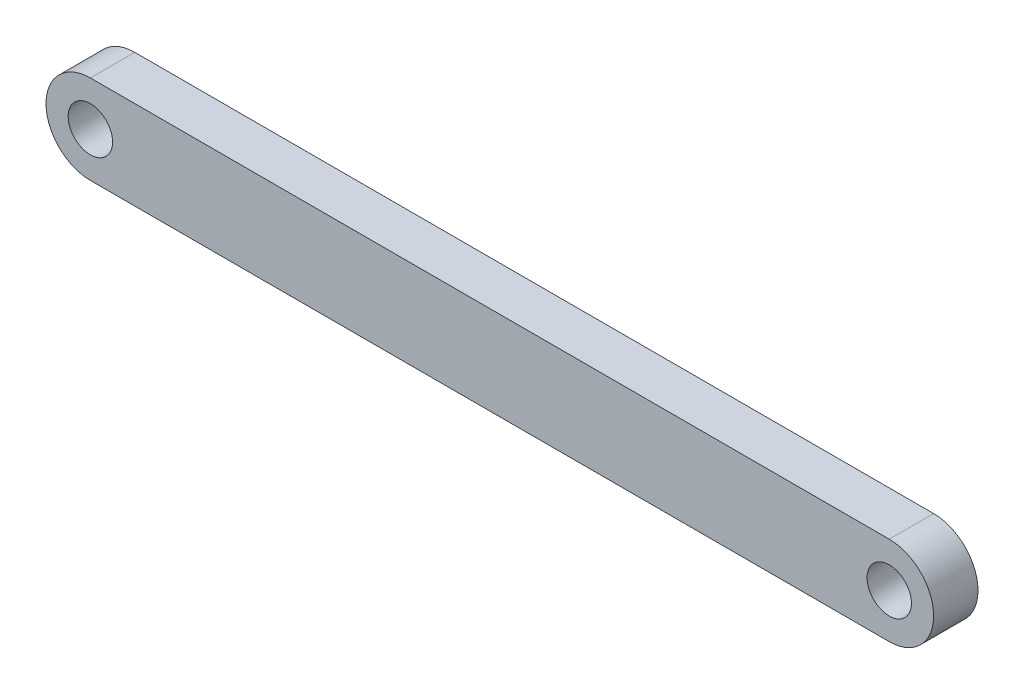
ISO-10303-21;
HEADER;
FILE_DESCRIPTION(('STEP AP214'),'2;1');
FILE_NAME('part.step','',(''),(''),'','','');
FILE_SCHEMA(('AUTOMOTIVE_DESIGN { 1 0 10303 214 1 1 1 1 }'));
ENDSEC;
DATA;
#1=APPLICATION_CONTEXT('core data for automotive mechanical design processes');
#2=APPLICATION_PROTOCOL_DEFINITION('international standard','automotive_design',2000,#1);
#3=PRODUCT_CONTEXT('',#1,'mechanical');
#4=PRODUCT('Part','Part','',(#3));
#5=PRODUCT_RELATED_PRODUCT_CATEGORY('part','',(#4));
#6=PRODUCT_DEFINITION_FORMATION('','',#4);
#7=PRODUCT_DEFINITION_CONTEXT('part definition',#1,'design');
#8=PRODUCT_DEFINITION('design','',#6,#7);
#9=PRODUCT_DEFINITION_SHAPE('','',#8);
#10=(LENGTH_UNIT() NAMED_UNIT(*) SI_UNIT(.MILLI.,.METRE.));
#11=(NAMED_UNIT(*) PLANE_ANGLE_UNIT() SI_UNIT($,.RADIAN.));
#12=(NAMED_UNIT(*) SI_UNIT($,.STERADIAN.) SOLID_ANGLE_UNIT());
#13=UNCERTAINTY_MEASURE_WITH_UNIT(LENGTH_MEASURE(1.E-05),#10,'distance_accuracy_value','');
#14=(GEOMETRIC_REPRESENTATION_CONTEXT(3) GLOBAL_UNCERTAINTY_ASSIGNED_CONTEXT((#13)) GLOBAL_UNIT_ASSIGNED_CONTEXT((#10,
#11,#12)) REPRESENTATION_CONTEXT('',''));
#15=CARTESIAN_POINT('',(0.,0.,0.));
#16=DIRECTION('',(0.,0.,1.));
#17=DIRECTION('',(1.,0.,0.));
#18=AXIS2_PLACEMENT_3D('',#15,#16,#17);
#19=CARTESIAN_POINT('',(0.,0.,2.));
#20=DIRECTION('',(0.,0.,1.));
#21=DIRECTION('',(1.,0.,0.));
#22=AXIS2_PLACEMENT_3D('',#19,#20,#21);
#23=PLANE('',#22);
#24=CARTESIAN_POINT('',(0.,0.,2.));
#25=DIRECTION('',(0.,0.,1.));
#26=DIRECTION('',(1.,0.,0.));
#27=AXIS2_PLACEMENT_3D('',#24,#25,#26);
#28=CIRCLE('',#27,1.);
#29=CARTESIAN_POINT('',(1.,0.,2.));
#30=VERTEX_POINT('',#29);
#31=EDGE_CURVE('E116',#30,#30,#28,.T.);
#32=ORIENTED_EDGE('',*,*,#31,.F.);
#33=EDGE_LOOP('',(#32));
#34=FACE_BOUND('',#33,.T.);
#35=CARTESIAN_POINT('',(0.,0.,2.));
#36=DIRECTION('',(0.,0.,1.));
#37=DIRECTION('',(1.,0.,0.));
#38=AXIS2_PLACEMENT_3D('',#35,#36,#37);
#39=CIRCLE('',#38,2.);
#40=CARTESIAN_POINT('',(0.,2.,2.));
#41=VERTEX_POINT('',#40);
#42=CARTESIAN_POINT('',(0.,-2.,2.));
#43=VERTEX_POINT('',#42);
#44=EDGE_CURVE('E96',#41,#43,#39,.T.);
#45=ORIENTED_EDGE('',*,*,#44,.T.);
#46=DIRECTION('',(1.,0.,0.));
#47=VECTOR('',#46,1.);
#48=CARTESIAN_POINT('',(0.,-2.,2.));
#49=LINE('',#48,#47);
#50=CARTESIAN_POINT('',(36.,-2.,2.));
#51=VERTEX_POINT('',#50);
#52=EDGE_CURVE('E91',#43,#51,#49,.T.);
#53=ORIENTED_EDGE('',*,*,#52,.T.);
#54=CARTESIAN_POINT('',(36.,0.,2.));
#55=DIRECTION('',(0.,0.,1.));
#56=DIRECTION('',(1.,0.,0.));
#57=AXIS2_PLACEMENT_3D('',#54,#55,#56);
#58=CIRCLE('',#57,2.);
#59=CARTESIAN_POINT('',(36.,2.,2.));
#60=VERTEX_POINT('',#59);
#61=EDGE_CURVE('E94',#51,#60,#58,.T.);
#62=ORIENTED_EDGE('',*,*,#61,.T.);
#63=DIRECTION('',(-1.,0.,0.));
#64=VECTOR('',#63,1.);
#65=CARTESIAN_POINT('',(0.,2.,2.));
#66=LINE('',#65,#64);
#67=EDGE_CURVE('E61',#60,#41,#66,.T.);
#68=ORIENTED_EDGE('',*,*,#67,.T.);
#69=EDGE_LOOP('',(#45,#53,#62,#68));
#70=FACE_BOUND('',#69,.T.);
#71=CARTESIAN_POINT('',(36.,0.,2.));
#72=DIRECTION('',(0.,0.,1.));
#73=DIRECTION('',(1.,0.,0.));
#74=AXIS2_PLACEMENT_3D('',#71,#72,#73);
#75=CIRCLE('',#74,0.999999999999998);
#76=CARTESIAN_POINT('',(37.,0.,2.));
#77=VERTEX_POINT('',#76);
#78=EDGE_CURVE('E138',#77,#77,#75,.T.);
#79=ORIENTED_EDGE('',*,*,#78,.F.);
#80=EDGE_LOOP('',(#79));
#81=FACE_BOUND('',#80,.T.);
#82=ADVANCED_FACE('F43',(#34,#70,#81),#23,.T.);
#83=CARTESIAN_POINT('',(0.,0.,0.));
#84=DIRECTION('',(0.,0.,1.));
#85=DIRECTION('',(1.,0.,0.));
#86=AXIS2_PLACEMENT_3D('',#83,#84,#85);
#87=PLANE('',#86);
#88=CARTESIAN_POINT('',(0.,0.,0.));
#89=DIRECTION('',(0.,0.,1.));
#90=DIRECTION('',(1.,0.,0.));
#91=AXIS2_PLACEMENT_3D('',#88,#89,#90);
#92=CIRCLE('',#91,2.);
#93=CARTESIAN_POINT('',(0.,2.,0.));
#94=VERTEX_POINT('',#93);
#95=CARTESIAN_POINT('',(0.,-2.,0.));
#96=VERTEX_POINT('',#95);
#97=EDGE_CURVE('E112',#94,#96,#92,.T.);
#98=ORIENTED_EDGE('',*,*,#97,.F.);
#99=DIRECTION('',(-1.,0.,0.));
#100=VECTOR('',#99,1.);
#101=CARTESIAN_POINT('',(0.,2.,0.));
#102=LINE('',#101,#100);
#103=CARTESIAN_POINT('',(36.,2.,0.));
#104=VERTEX_POINT('',#103);
#105=EDGE_CURVE('E84',#104,#94,#102,.T.);
#106=ORIENTED_EDGE('',*,*,#105,.F.);
#107=CARTESIAN_POINT('',(36.,0.,0.));
#108=DIRECTION('',(0.,0.,1.));
#109=DIRECTION('',(1.,0.,0.));
#110=AXIS2_PLACEMENT_3D('',#107,#108,#109);
#111=CIRCLE('',#110,2.);
#112=CARTESIAN_POINT('',(36.,-2.,0.));
#113=VERTEX_POINT('',#112);
#114=EDGE_CURVE('E78',#113,#104,#111,.T.);
#115=ORIENTED_EDGE('',*,*,#114,.F.);
#116=DIRECTION('',(1.,0.,0.));
#117=VECTOR('',#116,1.);
#118=CARTESIAN_POINT('',(0.,-2.,0.));
#119=LINE('',#118,#117);
#120=EDGE_CURVE('E101',#96,#113,#119,.T.);
#121=ORIENTED_EDGE('',*,*,#120,.F.);
#122=EDGE_LOOP('',(#98,#106,#115,#121));
#123=FACE_BOUND('',#122,.T.);
#124=CARTESIAN_POINT('',(0.,0.,0.));
#125=DIRECTION('',(0.,0.,1.));
#126=DIRECTION('',(1.,0.,0.));
#127=AXIS2_PLACEMENT_3D('',#124,#125,#126);
#128=CIRCLE('',#127,1.);
#129=CARTESIAN_POINT('',(1.,0.,0.));
#130=VERTEX_POINT('',#129);
#131=EDGE_CURVE('E134',#130,#130,#128,.T.);
#132=ORIENTED_EDGE('',*,*,#131,.T.);
#133=EDGE_LOOP('',(#132));
#134=FACE_BOUND('',#133,.T.);
#135=CARTESIAN_POINT('',(36.,0.,0.));
#136=DIRECTION('',(0.,0.,1.));
#137=DIRECTION('',(1.,0.,0.));
#138=AXIS2_PLACEMENT_3D('',#135,#136,#137);
#139=CIRCLE('',#138,0.999999999999998);
#140=CARTESIAN_POINT('',(37.,0.,0.));
#141=VERTEX_POINT('',#140);
#142=EDGE_CURVE('E142',#141,#141,#139,.T.);
#143=ORIENTED_EDGE('',*,*,#142,.T.);
#144=EDGE_LOOP('',(#143));
#145=FACE_BOUND('',#144,.T.);
#146=ADVANCED_FACE('F129',(#123,#134,#145),#87,.F.);
#147=CARTESIAN_POINT('',(0.,0.,2.));
#148=DIRECTION('',(0.,0.,-1.));
#149=DIRECTION('',(-1.,0.,0.));
#150=AXIS2_PLACEMENT_3D('',#147,#148,#149);
#151=CYLINDRICAL_SURFACE('',#150,2.);
#152=ORIENTED_EDGE('',*,*,#97,.T.);
#153=DIRECTION('',(0.,0.,-1.));
#154=VECTOR('',#153,1.);
#155=CARTESIAN_POINT('',(0.,-2.,2.));
#156=LINE('',#155,#154);
#157=EDGE_CURVE('E11',#43,#96,#156,.T.);
#158=ORIENTED_EDGE('',*,*,#157,.F.);
#159=ORIENTED_EDGE('',*,*,#44,.F.);
#160=DIRECTION('',(0.,0.,-1.));
#161=VECTOR('',#160,1.);
#162=CARTESIAN_POINT('',(0.,2.,2.));
#163=LINE('',#162,#161);
#164=EDGE_CURVE('E108',#41,#94,#163,.T.);
#165=ORIENTED_EDGE('',*,*,#164,.T.);
#166=EDGE_LOOP('',(#152,#158,#159,#165));
#167=FACE_BOUND('',#166,.T.);
#168=ADVANCED_FACE('F45',(#167),#151,.T.);
#169=CARTESIAN_POINT('',(0.,-2.,2.));
#170=DIRECTION('',(0.,1.,0.));
#171=DIRECTION('',(0.,0.,1.));
#172=AXIS2_PLACEMENT_3D('',#169,#170,#171);
#173=PLANE('',#172);
#174=ORIENTED_EDGE('',*,*,#120,.T.);
#175=DIRECTION('',(0.,0.,-1.));
#176=VECTOR('',#175,1.);
#177=CARTESIAN_POINT('',(36.,-2.,2.));
#178=LINE('',#177,#176);
#179=EDGE_CURVE('E53',#51,#113,#178,.T.);
#180=ORIENTED_EDGE('',*,*,#179,.F.);
#181=ORIENTED_EDGE('',*,*,#52,.F.);
#182=ORIENTED_EDGE('',*,*,#157,.T.);
#183=EDGE_LOOP('',(#174,#180,#181,#182));
#184=FACE_BOUND('',#183,.T.);
#185=ADVANCED_FACE('F100',(#184),#173,.F.);
#186=CARTESIAN_POINT('',(36.,0.,2.));
#187=DIRECTION('',(0.,0.,-1.));
#188=DIRECTION('',(-1.,0.,0.));
#189=AXIS2_PLACEMENT_3D('',#186,#187,#188);
#190=CYLINDRICAL_SURFACE('',#189,2.);
#191=ORIENTED_EDGE('',*,*,#114,.T.);
#192=DIRECTION('',(0.,0.,-1.));
#193=VECTOR('',#192,1.);
#194=CARTESIAN_POINT('',(36.,2.,2.));
#195=LINE('',#194,#193);
#196=EDGE_CURVE('E103',#60,#104,#195,.T.);
#197=ORIENTED_EDGE('',*,*,#196,.F.);
#198=ORIENTED_EDGE('',*,*,#61,.F.);
#199=ORIENTED_EDGE('',*,*,#179,.T.);
#200=EDGE_LOOP('',(#191,#197,#198,#199));
#201=FACE_BOUND('',#200,.T.);
#202=ADVANCED_FACE('F104',(#201),#190,.T.);
#203=CARTESIAN_POINT('',(0.,2.,2.));
#204=DIRECTION('',(0.,-1.,0.));
#205=DIRECTION('',(0.,0.,-1.));
#206=AXIS2_PLACEMENT_3D('',#203,#204,#205);
#207=PLANE('',#206);
#208=ORIENTED_EDGE('',*,*,#105,.T.);
#209=ORIENTED_EDGE('',*,*,#164,.F.);
#210=ORIENTED_EDGE('',*,*,#67,.F.);
#211=ORIENTED_EDGE('',*,*,#196,.T.);
#212=EDGE_LOOP('',(#208,#209,#210,#211));
#213=FACE_BOUND('',#212,.T.);
#214=ADVANCED_FACE('F126',(#213),#207,.F.);
#215=CARTESIAN_POINT('',(0.,0.,2.));
#216=DIRECTION('',(0.,0.,-1.));
#217=DIRECTION('',(-1.,0.,0.));
#218=AXIS2_PLACEMENT_3D('',#215,#216,#217);
#219=CYLINDRICAL_SURFACE('',#218,1.);
#220=ORIENTED_EDGE('',*,*,#31,.T.);
#221=EDGE_LOOP('',(#220));
#222=FACE_BOUND('',#221,.T.);
#223=ORIENTED_EDGE('',*,*,#131,.F.);
#224=EDGE_LOOP('',(#223));
#225=FACE_BOUND('',#224,.T.);
#226=ADVANCED_FACE('F161',(#222,#225),#219,.F.);
#227=CARTESIAN_POINT('',(36.,0.,2.));
#228=DIRECTION('',(0.,0.,-1.));
#229=DIRECTION('',(-1.,0.,0.));
#230=AXIS2_PLACEMENT_3D('',#227,#228,#229);
#231=CYLINDRICAL_SURFACE('',#230,0.999999999999998);
#232=ORIENTED_EDGE('',*,*,#78,.T.);
#233=EDGE_LOOP('',(#232));
#234=FACE_BOUND('',#233,.T.);
#235=ORIENTED_EDGE('',*,*,#142,.F.);
#236=EDGE_LOOP('',(#235));
#237=FACE_BOUND('',#236,.T.);
#238=ADVANCED_FACE('F150',(#234,#237),#231,.F.);
#239=CLOSED_SHELL('',(#82,#146,#168,#185,#202,#214,#226,#238));
#240=MANIFOLD_SOLID_BREP('B2',#239);
#241=ADVANCED_BREP_SHAPE_REPRESENTATION('',(#18,#240),#14);
#242=SHAPE_DEFINITION_REPRESENTATION(#9,#241);
ENDSEC;
END-ISO-10303-21;
